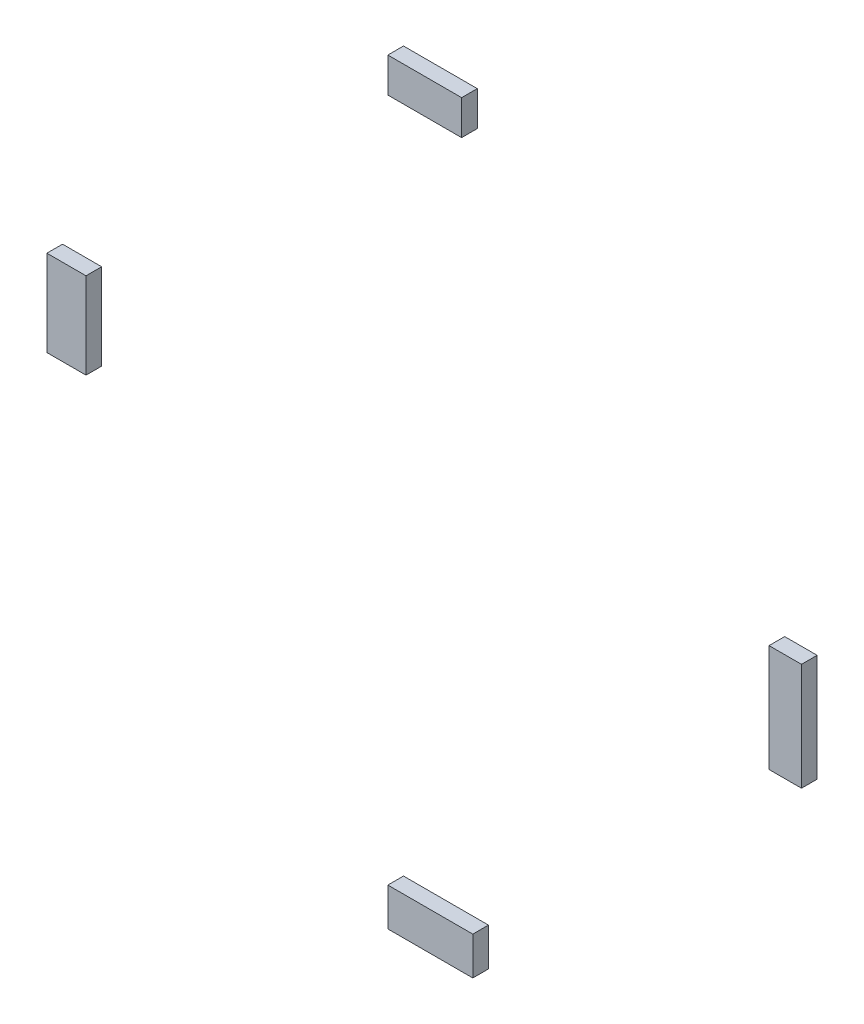
ISO-10303-21;
HEADER;
FILE_DESCRIPTION(('STEP AP214'),'2;1');
FILE_NAME('part.step','',(''),(''),'','','');
FILE_SCHEMA(('AUTOMOTIVE_DESIGN { 1 0 10303 214 1 1 1 1 }'));
ENDSEC;
DATA;
#1=APPLICATION_CONTEXT('core data for automotive mechanical design processes');
#2=APPLICATION_PROTOCOL_DEFINITION('international standard','automotive_design',2000,#1);
#3=PRODUCT_CONTEXT('',#1,'mechanical');
#4=PRODUCT('Part','Part','',(#3));
#5=PRODUCT_RELATED_PRODUCT_CATEGORY('part','',(#4));
#6=PRODUCT_DEFINITION_FORMATION('','',#4);
#7=PRODUCT_DEFINITION_CONTEXT('part definition',#1,'design');
#8=PRODUCT_DEFINITION('design','',#6,#7);
#9=PRODUCT_DEFINITION_SHAPE('','',#8);
#10=(LENGTH_UNIT() NAMED_UNIT(*) SI_UNIT(.MILLI.,.METRE.));
#11=(NAMED_UNIT(*) PLANE_ANGLE_UNIT() SI_UNIT($,.RADIAN.));
#12=(NAMED_UNIT(*) SI_UNIT($,.STERADIAN.) SOLID_ANGLE_UNIT());
#13=UNCERTAINTY_MEASURE_WITH_UNIT(LENGTH_MEASURE(1.E-05),#10,'distance_accuracy_value','');
#14=(GEOMETRIC_REPRESENTATION_CONTEXT(3) GLOBAL_UNCERTAINTY_ASSIGNED_CONTEXT((#13)) GLOBAL_UNIT_ASSIGNED_CONTEXT((#10,
#11,#12)) REPRESENTATION_CONTEXT('',''));
#15=CARTESIAN_POINT('',(0.,0.,0.));
#16=DIRECTION('',(0.,0.,1.));
#17=DIRECTION('',(1.,0.,0.));
#18=AXIS2_PLACEMENT_3D('',#15,#16,#17);
#19=CARTESIAN_POINT('',(-7.17351111937392,-65.1449777129052,3.));
#20=DIRECTION('',(1.,0.,0.));
#21=DIRECTION('',(0.,0.,-1.));
#22=AXIS2_PLACEMENT_3D('',#19,#20,#21);
#23=PLANE('',#22);
#24=DIRECTION('',(0.,-1.,0.));
#25=VECTOR('',#24,1.);
#26=CARTESIAN_POINT('',(-7.17351111937392,-65.1449777129052,0.));
#27=LINE('',#26,#25);
#28=CARTESIAN_POINT('',(-7.17351111937392,-65.1449777129052,0.));
#29=VERTEX_POINT('',#28);
#30=CARTESIAN_POINT('',(-7.17351111937392,-72.4317120589617,0.));
#31=VERTEX_POINT('',#30);
#32=EDGE_CURVE('E12',#29,#31,#27,.T.);
#33=ORIENTED_EDGE('',*,*,#32,.T.);
#34=DIRECTION('',(0.,0.,-1.));
#35=VECTOR('',#34,1.);
#36=CARTESIAN_POINT('',(-7.17351111937392,-72.4317120589617,3.));
#37=LINE('',#36,#35);
#38=CARTESIAN_POINT('',(-7.17351111937392,-72.4317120589617,3.));
#39=VERTEX_POINT('',#38);
#40=EDGE_CURVE('E121',#39,#31,#37,.T.);
#41=ORIENTED_EDGE('',*,*,#40,.F.);
#42=DIRECTION('',(0.,-1.,0.));
#43=VECTOR('',#42,1.);
#44=CARTESIAN_POINT('',(-7.17351111937392,-65.1449777129052,3.));
#45=LINE('',#44,#43);
#46=CARTESIAN_POINT('',(-7.17351111937392,-65.1449777129052,3.));
#47=VERTEX_POINT('',#46);
#48=EDGE_CURVE('E54',#47,#39,#45,.T.);
#49=ORIENTED_EDGE('',*,*,#48,.F.);
#50=DIRECTION('',(0.,0.,-1.));
#51=VECTOR('',#50,1.);
#52=CARTESIAN_POINT('',(-7.17351111937392,-65.1449777129052,3.));
#53=LINE('',#52,#51);
#54=EDGE_CURVE('E109',#47,#29,#53,.T.);
#55=ORIENTED_EDGE('',*,*,#54,.T.);
#56=EDGE_LOOP('',(#33,#41,#49,#55));
#57=FACE_BOUND('',#56,.T.);
#58=ADVANCED_FACE('F50',(#57),#23,.F.);
#59=CARTESIAN_POINT('',(-7.17351111937392,-72.4317120589617,3.));
#60=DIRECTION('',(0.,1.,0.));
#61=DIRECTION('',(0.,0.,1.));
#62=AXIS2_PLACEMENT_3D('',#59,#60,#61);
#63=PLANE('',#62);
#64=DIRECTION('',(1.,0.,0.));
#65=VECTOR('',#64,1.);
#66=CARTESIAN_POINT('',(-7.17351111937392,-72.4317120589617,0.));
#67=LINE('',#66,#65);
#68=CARTESIAN_POINT('',(9.11448330122297,-72.4317120589617,0.));
#69=VERTEX_POINT('',#68);
#70=EDGE_CURVE('E60',#31,#69,#67,.T.);
#71=ORIENTED_EDGE('',*,*,#70,.T.);
#72=DIRECTION('',(0.,0.,-1.));
#73=VECTOR('',#72,1.);
#74=CARTESIAN_POINT('',(9.11448330122297,-72.4317120589617,3.));
#75=LINE('',#74,#73);
#76=CARTESIAN_POINT('',(9.11448330122297,-72.4317120589617,3.));
#77=VERTEX_POINT('',#76);
#78=EDGE_CURVE('E105',#77,#69,#75,.T.);
#79=ORIENTED_EDGE('',*,*,#78,.F.);
#80=DIRECTION('',(1.,0.,0.));
#81=VECTOR('',#80,1.);
#82=CARTESIAN_POINT('',(-7.17351111937392,-72.4317120589617,3.));
#83=LINE('',#82,#81);
#84=EDGE_CURVE('E84',#39,#77,#83,.T.);
#85=ORIENTED_EDGE('',*,*,#84,.F.);
#86=ORIENTED_EDGE('',*,*,#40,.T.);
#87=EDGE_LOOP('',(#71,#79,#85,#86));
#88=FACE_BOUND('',#87,.T.);
#89=ADVANCED_FACE('F124',(#88),#63,.F.);
#90=CARTESIAN_POINT('',(9.11448330122297,-65.1449777129052,3.));
#91=DIRECTION('',(-1.,0.,0.));
#92=DIRECTION('',(0.,0.,1.));
#93=AXIS2_PLACEMENT_3D('',#90,#91,#92);
#94=PLANE('',#93);
#95=DIRECTION('',(0.,1.,0.));
#96=VECTOR('',#95,1.);
#97=CARTESIAN_POINT('',(9.11448330122297,-65.1449777129052,0.));
#98=LINE('',#97,#96);
#99=CARTESIAN_POINT('',(9.11448330122297,-65.1449777129052,0.));
#100=VERTEX_POINT('',#99);
#101=EDGE_CURVE('E100',#69,#100,#98,.T.);
#102=ORIENTED_EDGE('',*,*,#101,.T.);
#103=DIRECTION('',(0.,0.,-1.));
#104=VECTOR('',#103,1.);
#105=CARTESIAN_POINT('',(9.11448330122297,-65.1449777129052,3.));
#106=LINE('',#105,#104);
#107=CARTESIAN_POINT('',(9.11448330122297,-65.1449777129052,3.));
#108=VERTEX_POINT('',#107);
#109=EDGE_CURVE('E103',#108,#100,#106,.T.);
#110=ORIENTED_EDGE('',*,*,#109,.F.);
#111=DIRECTION('',(0.,1.,0.));
#112=VECTOR('',#111,1.);
#113=CARTESIAN_POINT('',(9.11448330122297,-65.1449777129052,3.));
#114=LINE('',#113,#112);
#115=EDGE_CURVE('E117',#77,#108,#114,.T.);
#116=ORIENTED_EDGE('',*,*,#115,.F.);
#117=ORIENTED_EDGE('',*,*,#78,.T.);
#118=EDGE_LOOP('',(#102,#110,#116,#117));
#119=FACE_BOUND('',#118,.T.);
#120=ADVANCED_FACE('F101',(#119),#94,.F.);
#121=CARTESIAN_POINT('',(-7.17351111937392,-65.1449777129052,3.));
#122=DIRECTION('',(0.,-1.,0.));
#123=DIRECTION('',(0.,0.,-1.));
#124=AXIS2_PLACEMENT_3D('',#121,#122,#123);
#125=PLANE('',#124);
#126=DIRECTION('',(-1.,0.,0.));
#127=VECTOR('',#126,1.);
#128=CARTESIAN_POINT('',(-7.17351111937392,-65.1449777129052,0.));
#129=LINE('',#128,#127);
#130=EDGE_CURVE('E94',#100,#29,#129,.T.);
#131=ORIENTED_EDGE('',*,*,#130,.T.);
#132=ORIENTED_EDGE('',*,*,#54,.F.);
#133=DIRECTION('',(-1.,0.,0.));
#134=VECTOR('',#133,1.);
#135=CARTESIAN_POINT('',(-7.17351111937392,-65.1449777129052,3.));
#136=LINE('',#135,#134);
#137=EDGE_CURVE('E108',#108,#47,#136,.T.);
#138=ORIENTED_EDGE('',*,*,#137,.F.);
#139=ORIENTED_EDGE('',*,*,#109,.T.);
#140=EDGE_LOOP('',(#131,#132,#138,#139));
#141=FACE_BOUND('',#140,.T.);
#142=ADVANCED_FACE('F107',(#141),#125,.F.);
#143=CARTESIAN_POINT('',(0.,0.,3.));
#144=DIRECTION('',(0.,0.,1.));
#145=DIRECTION('',(1.,0.,0.));
#146=AXIS2_PLACEMENT_3D('',#143,#144,#145);
#147=PLANE('',#146);
#148=ORIENTED_EDGE('',*,*,#48,.T.);
#149=ORIENTED_EDGE('',*,*,#84,.T.);
#150=ORIENTED_EDGE('',*,*,#115,.T.);
#151=ORIENTED_EDGE('',*,*,#137,.T.);
#152=EDGE_LOOP('',(#148,#149,#150,#151));
#153=FACE_BOUND('',#152,.T.);
#154=ADVANCED_FACE('F52',(#153),#147,.T.);
#155=CARTESIAN_POINT('',(0.,0.,0.));
#156=DIRECTION('',(0.,0.,1.));
#157=DIRECTION('',(1.,0.,0.));
#158=AXIS2_PLACEMENT_3D('',#155,#156,#157);
#159=PLANE('',#158);
#160=ORIENTED_EDGE('',*,*,#32,.F.);
#161=ORIENTED_EDGE('',*,*,#130,.F.);
#162=ORIENTED_EDGE('',*,*,#101,.F.);
#163=ORIENTED_EDGE('',*,*,#70,.F.);
#164=EDGE_LOOP('',(#160,#161,#162,#163));
#165=FACE_BOUND('',#164,.T.);
#166=ADVANCED_FACE('F111',(#165),#159,.F.);
#167=CLOSED_SHELL('',(#58,#89,#120,#142,#154,#166));
#168=MANIFOLD_SOLID_BREP('B2',#167);
#169=CARTESIAN_POINT('',(65.9081480572516,11.1514172046276,3.));
#170=DIRECTION('',(1.,0.,0.));
#171=DIRECTION('',(0.,0.,-1.));
#172=AXIS2_PLACEMENT_3D('',#169,#170,#171);
#173=PLANE('',#172);
#174=DIRECTION('',(0.,-1.,0.));
#175=VECTOR('',#174,1.);
#176=CARTESIAN_POINT('',(65.9081480572516,11.1514172046276,0.));
#177=LINE('',#176,#175);
#178=CARTESIAN_POINT('',(65.9081480572516,11.1514172046276,0.));
#179=VERTEX_POINT('',#178);
#180=CARTESIAN_POINT('',(65.9081480572516,-9.42289153717896,0.));
#181=VERTEX_POINT('',#180);
#182=EDGE_CURVE('E48',#179,#181,#177,.T.);
#183=ORIENTED_EDGE('',*,*,#182,.T.);
#184=DIRECTION('',(0.,0.,-1.));
#185=VECTOR('',#184,1.);
#186=CARTESIAN_POINT('',(65.9081480572516,-9.42289153717896,3.));
#187=LINE('',#186,#185);
#188=CARTESIAN_POINT('',(65.9081480572516,-9.42289153717896,3.));
#189=VERTEX_POINT('',#188);
#190=EDGE_CURVE('E255',#189,#181,#187,.T.);
#191=ORIENTED_EDGE('',*,*,#190,.F.);
#192=DIRECTION('',(0.,-1.,0.));
#193=VECTOR('',#192,1.);
#194=CARTESIAN_POINT('',(65.9081480572516,11.1514172046276,3.));
#195=LINE('',#194,#193);
#196=CARTESIAN_POINT('',(65.9081480572516,11.1514172046276,3.));
#197=VERTEX_POINT('',#196);
#198=EDGE_CURVE('E188',#197,#189,#195,.T.);
#199=ORIENTED_EDGE('',*,*,#198,.F.);
#200=DIRECTION('',(0.,0.,-1.));
#201=VECTOR('',#200,1.);
#202=CARTESIAN_POINT('',(65.9081480572516,11.1514172046276,3.));
#203=LINE('',#202,#201);
#204=EDGE_CURVE('E243',#197,#179,#203,.T.);
#205=ORIENTED_EDGE('',*,*,#204,.T.);
#206=EDGE_LOOP('',(#183,#191,#199,#205));
#207=FACE_BOUND('',#206,.T.);
#208=ADVANCED_FACE('F184',(#207),#173,.F.);
#209=CARTESIAN_POINT('',(65.9081480572516,-9.42289153717896,3.));
#210=DIRECTION('',(0.,1.,0.));
#211=DIRECTION('',(0.,0.,1.));
#212=AXIS2_PLACEMENT_3D('',#209,#210,#211);
#213=PLANE('',#212);
#214=DIRECTION('',(1.,0.,0.));
#215=VECTOR('',#214,1.);
#216=CARTESIAN_POINT('',(65.9081480572516,-9.42289153717896,0.));
#217=LINE('',#216,#215);
#218=CARTESIAN_POINT('',(72.1233038230056,-9.42289153717896,0.));
#219=VERTEX_POINT('',#218);
#220=EDGE_CURVE('E194',#181,#219,#217,.T.);
#221=ORIENTED_EDGE('',*,*,#220,.T.);
#222=DIRECTION('',(0.,0.,-1.));
#223=VECTOR('',#222,1.);
#224=CARTESIAN_POINT('',(72.1233038230056,-9.42289153717896,3.));
#225=LINE('',#224,#223);
#226=CARTESIAN_POINT('',(72.1233038230056,-9.42289153717896,3.));
#227=VERTEX_POINT('',#226);
#228=EDGE_CURVE('E239',#227,#219,#225,.T.);
#229=ORIENTED_EDGE('',*,*,#228,.F.);
#230=DIRECTION('',(1.,0.,0.));
#231=VECTOR('',#230,1.);
#232=CARTESIAN_POINT('',(65.9081480572516,-9.42289153717896,3.));
#233=LINE('',#232,#231);
#234=EDGE_CURVE('E218',#189,#227,#233,.T.);
#235=ORIENTED_EDGE('',*,*,#234,.F.);
#236=ORIENTED_EDGE('',*,*,#190,.T.);
#237=EDGE_LOOP('',(#221,#229,#235,#236));
#238=FACE_BOUND('',#237,.T.);
#239=ADVANCED_FACE('F258',(#238),#213,.F.);
#240=CARTESIAN_POINT('',(72.1233038230056,11.1514172046276,3.));
#241=DIRECTION('',(-1.,0.,0.));
#242=DIRECTION('',(0.,0.,1.));
#243=AXIS2_PLACEMENT_3D('',#240,#241,#242);
#244=PLANE('',#243);
#245=DIRECTION('',(0.,1.,0.));
#246=VECTOR('',#245,1.);
#247=CARTESIAN_POINT('',(72.1233038230056,11.1514172046276,0.));
#248=LINE('',#247,#246);
#249=CARTESIAN_POINT('',(72.1233038230056,11.1514172046276,0.));
#250=VERTEX_POINT('',#249);
#251=EDGE_CURVE('E234',#219,#250,#248,.T.);
#252=ORIENTED_EDGE('',*,*,#251,.T.);
#253=DIRECTION('',(0.,0.,-1.));
#254=VECTOR('',#253,1.);
#255=CARTESIAN_POINT('',(72.1233038230056,11.1514172046276,3.));
#256=LINE('',#255,#254);
#257=CARTESIAN_POINT('',(72.1233038230056,11.1514172046276,3.));
#258=VERTEX_POINT('',#257);
#259=EDGE_CURVE('E237',#258,#250,#256,.T.);
#260=ORIENTED_EDGE('',*,*,#259,.F.);
#261=DIRECTION('',(0.,1.,0.));
#262=VECTOR('',#261,1.);
#263=CARTESIAN_POINT('',(72.1233038230056,11.1514172046276,3.));
#264=LINE('',#263,#262);
#265=EDGE_CURVE('E251',#227,#258,#264,.T.);
#266=ORIENTED_EDGE('',*,*,#265,.F.);
#267=ORIENTED_EDGE('',*,*,#228,.T.);
#268=EDGE_LOOP('',(#252,#260,#266,#267));
#269=FACE_BOUND('',#268,.T.);
#270=ADVANCED_FACE('F235',(#269),#244,.F.);
#271=CARTESIAN_POINT('',(65.9081480572516,11.1514172046276,3.));
#272=DIRECTION('',(0.,-1.,0.));
#273=DIRECTION('',(0.,0.,-1.));
#274=AXIS2_PLACEMENT_3D('',#271,#272,#273);
#275=PLANE('',#274);
#276=DIRECTION('',(-1.,0.,0.));
#277=VECTOR('',#276,1.);
#278=CARTESIAN_POINT('',(65.9081480572516,11.1514172046276,0.));
#279=LINE('',#278,#277);
#280=EDGE_CURVE('E228',#250,#179,#279,.T.);
#281=ORIENTED_EDGE('',*,*,#280,.T.);
#282=ORIENTED_EDGE('',*,*,#204,.F.);
#283=DIRECTION('',(-1.,0.,0.));
#284=VECTOR('',#283,1.);
#285=CARTESIAN_POINT('',(65.9081480572516,11.1514172046276,3.));
#286=LINE('',#285,#284);
#287=EDGE_CURVE('E242',#258,#197,#286,.T.);
#288=ORIENTED_EDGE('',*,*,#287,.F.);
#289=ORIENTED_EDGE('',*,*,#259,.T.);
#290=EDGE_LOOP('',(#281,#282,#288,#289));
#291=FACE_BOUND('',#290,.T.);
#292=ADVANCED_FACE('F241',(#291),#275,.F.);
#293=CARTESIAN_POINT('',(0.,0.,3.));
#294=DIRECTION('',(0.,0.,1.));
#295=DIRECTION('',(1.,0.,0.));
#296=AXIS2_PLACEMENT_3D('',#293,#294,#295);
#297=PLANE('',#296);
#298=ORIENTED_EDGE('',*,*,#198,.T.);
#299=ORIENTED_EDGE('',*,*,#234,.T.);
#300=ORIENTED_EDGE('',*,*,#265,.T.);
#301=ORIENTED_EDGE('',*,*,#287,.T.);
#302=EDGE_LOOP('',(#298,#299,#300,#301));
#303=FACE_BOUND('',#302,.T.);
#304=ADVANCED_FACE('F186',(#303),#297,.T.);
#305=CARTESIAN_POINT('',(0.,0.,0.));
#306=DIRECTION('',(0.,0.,1.));
#307=DIRECTION('',(1.,0.,0.));
#308=AXIS2_PLACEMENT_3D('',#305,#306,#307);
#309=PLANE('',#308);
#310=ORIENTED_EDGE('',*,*,#182,.F.);
#311=ORIENTED_EDGE('',*,*,#280,.F.);
#312=ORIENTED_EDGE('',*,*,#251,.F.);
#313=ORIENTED_EDGE('',*,*,#220,.F.);
#314=EDGE_LOOP('',(#310,#311,#312,#313));
#315=FACE_BOUND('',#314,.T.);
#316=ADVANCED_FACE('F245',(#315),#309,.F.);
#317=CLOSED_SHELL('',(#208,#239,#270,#292,#304,#316));
#318=MANIFOLD_SOLID_BREP('B6',#317);
#319=CARTESIAN_POINT('',(-72.5398045178219,7.07941859947841,3.));
#320=DIRECTION('',(1.,0.,0.));
#321=DIRECTION('',(0.,0.,-1.));
#322=AXIS2_PLACEMENT_3D('',#319,#320,#321);
#323=PLANE('',#322);
#324=DIRECTION('',(0.,-1.,0.));
#325=VECTOR('',#324,1.);
#326=CARTESIAN_POINT('',(-72.5398045178219,7.07941859947841,0.));
#327=LINE('',#326,#325);
#328=CARTESIAN_POINT('',(-72.5398045178219,7.07941859947841,0.));
#329=VERTEX_POINT('',#328);
#330=CARTESIAN_POINT('',(-72.5398045178219,-9.42289153717896,0.));
#331=VERTEX_POINT('',#330);
#332=EDGE_CURVE('E182',#329,#331,#327,.T.);
#333=ORIENTED_EDGE('',*,*,#332,.T.);
#334=DIRECTION('',(0.,0.,-1.));
#335=VECTOR('',#334,1.);
#336=CARTESIAN_POINT('',(-72.5398045178219,-9.42289153717896,3.));
#337=LINE('',#336,#335);
#338=CARTESIAN_POINT('',(-72.5398045178219,-9.42289153717896,3.));
#339=VERTEX_POINT('',#338);
#340=EDGE_CURVE('E388',#339,#331,#337,.T.);
#341=ORIENTED_EDGE('',*,*,#340,.F.);
#342=DIRECTION('',(0.,-1.,0.));
#343=VECTOR('',#342,1.);
#344=CARTESIAN_POINT('',(-72.5398045178219,7.07941859947841,3.));
#345=LINE('',#344,#343);
#346=CARTESIAN_POINT('',(-72.5398045178219,7.07941859947841,3.));
#347=VERTEX_POINT('',#346);
#348=EDGE_CURVE('E321',#347,#339,#345,.T.);
#349=ORIENTED_EDGE('',*,*,#348,.F.);
#350=DIRECTION('',(0.,0.,-1.));
#351=VECTOR('',#350,1.);
#352=CARTESIAN_POINT('',(-72.5398045178219,7.07941859947841,3.));
#353=LINE('',#352,#351);
#354=EDGE_CURVE('E376',#347,#329,#353,.T.);
#355=ORIENTED_EDGE('',*,*,#354,.T.);
#356=EDGE_LOOP('',(#333,#341,#349,#355));
#357=FACE_BOUND('',#356,.T.);
#358=ADVANCED_FACE('F317',(#357),#323,.F.);
#359=CARTESIAN_POINT('',(-72.5398045178219,-9.42289153717896,3.));
#360=DIRECTION('',(0.,1.,0.));
#361=DIRECTION('',(0.,0.,1.));
#362=AXIS2_PLACEMENT_3D('',#359,#360,#361);
#363=PLANE('',#362);
#364=DIRECTION('',(1.,0.,0.));
#365=VECTOR('',#364,1.);
#366=CARTESIAN_POINT('',(-72.5398045178219,-9.42289153717896,0.));
#367=LINE('',#366,#365);
#368=CARTESIAN_POINT('',(-65.0387544557049,-9.42289153717896,0.));
#369=VERTEX_POINT('',#368);
#370=EDGE_CURVE('E327',#331,#369,#367,.T.);
#371=ORIENTED_EDGE('',*,*,#370,.T.);
#372=DIRECTION('',(0.,0.,-1.));
#373=VECTOR('',#372,1.);
#374=CARTESIAN_POINT('',(-65.0387544557049,-9.42289153717896,3.));
#375=LINE('',#374,#373);
#376=CARTESIAN_POINT('',(-65.0387544557049,-9.42289153717896,3.));
#377=VERTEX_POINT('',#376);
#378=EDGE_CURVE('E372',#377,#369,#375,.T.);
#379=ORIENTED_EDGE('',*,*,#378,.F.);
#380=DIRECTION('',(1.,0.,0.));
#381=VECTOR('',#380,1.);
#382=CARTESIAN_POINT('',(-72.5398045178219,-9.42289153717896,3.));
#383=LINE('',#382,#381);
#384=EDGE_CURVE('E351',#339,#377,#383,.T.);
#385=ORIENTED_EDGE('',*,*,#384,.F.);
#386=ORIENTED_EDGE('',*,*,#340,.T.);
#387=EDGE_LOOP('',(#371,#379,#385,#386));
#388=FACE_BOUND('',#387,.T.);
#389=ADVANCED_FACE('F391',(#388),#363,.F.);
#390=CARTESIAN_POINT('',(-65.0387544557049,7.07941859947841,3.));
#391=DIRECTION('',(-1.,0.,0.));
#392=DIRECTION('',(0.,0.,1.));
#393=AXIS2_PLACEMENT_3D('',#390,#391,#392);
#394=PLANE('',#393);
#395=DIRECTION('',(0.,1.,0.));
#396=VECTOR('',#395,1.);
#397=CARTESIAN_POINT('',(-65.0387544557049,7.07941859947841,0.));
#398=LINE('',#397,#396);
#399=CARTESIAN_POINT('',(-65.0387544557049,7.07941859947841,0.));
#400=VERTEX_POINT('',#399);
#401=EDGE_CURVE('E367',#369,#400,#398,.T.);
#402=ORIENTED_EDGE('',*,*,#401,.T.);
#403=DIRECTION('',(0.,0.,-1.));
#404=VECTOR('',#403,1.);
#405=CARTESIAN_POINT('',(-65.0387544557049,7.07941859947841,3.));
#406=LINE('',#405,#404);
#407=CARTESIAN_POINT('',(-65.0387544557049,7.07941859947841,3.));
#408=VERTEX_POINT('',#407);
#409=EDGE_CURVE('E370',#408,#400,#406,.T.);
#410=ORIENTED_EDGE('',*,*,#409,.F.);
#411=DIRECTION('',(0.,1.,0.));
#412=VECTOR('',#411,1.);
#413=CARTESIAN_POINT('',(-65.0387544557049,7.07941859947841,3.));
#414=LINE('',#413,#412);
#415=EDGE_CURVE('E384',#377,#408,#414,.T.);
#416=ORIENTED_EDGE('',*,*,#415,.F.);
#417=ORIENTED_EDGE('',*,*,#378,.T.);
#418=EDGE_LOOP('',(#402,#410,#416,#417));
#419=FACE_BOUND('',#418,.T.);
#420=ADVANCED_FACE('F368',(#419),#394,.F.);
#421=CARTESIAN_POINT('',(-72.5398045178219,7.07941859947841,3.));
#422=DIRECTION('',(0.,-1.,0.));
#423=DIRECTION('',(0.,0.,-1.));
#424=AXIS2_PLACEMENT_3D('',#421,#422,#423);
#425=PLANE('',#424);
#426=DIRECTION('',(-1.,0.,0.));
#427=VECTOR('',#426,1.);
#428=CARTESIAN_POINT('',(-72.5398045178219,7.07941859947841,0.));
#429=LINE('',#428,#427);
#430=EDGE_CURVE('E361',#400,#329,#429,.T.);
#431=ORIENTED_EDGE('',*,*,#430,.T.);
#432=ORIENTED_EDGE('',*,*,#354,.F.);
#433=DIRECTION('',(-1.,0.,0.));
#434=VECTOR('',#433,1.);
#435=CARTESIAN_POINT('',(-72.5398045178219,7.07941859947841,3.));
#436=LINE('',#435,#434);
#437=EDGE_CURVE('E375',#408,#347,#436,.T.);
#438=ORIENTED_EDGE('',*,*,#437,.F.);
#439=ORIENTED_EDGE('',*,*,#409,.T.);
#440=EDGE_LOOP('',(#431,#432,#438,#439));
#441=FACE_BOUND('',#440,.T.);
#442=ADVANCED_FACE('F374',(#441),#425,.F.);
#443=CARTESIAN_POINT('',(0.,0.,3.));
#444=DIRECTION('',(0.,0.,1.));
#445=DIRECTION('',(1.,0.,0.));
#446=AXIS2_PLACEMENT_3D('',#443,#444,#445);
#447=PLANE('',#446);
#448=ORIENTED_EDGE('',*,*,#348,.T.);
#449=ORIENTED_EDGE('',*,*,#384,.T.);
#450=ORIENTED_EDGE('',*,*,#415,.T.);
#451=ORIENTED_EDGE('',*,*,#437,.T.);
#452=EDGE_LOOP('',(#448,#449,#450,#451));
#453=FACE_BOUND('',#452,.T.);
#454=ADVANCED_FACE('F319',(#453),#447,.T.);
#455=CARTESIAN_POINT('',(0.,0.,0.));
#456=DIRECTION('',(0.,0.,1.));
#457=DIRECTION('',(1.,0.,0.));
#458=AXIS2_PLACEMENT_3D('',#455,#456,#457);
#459=PLANE('',#458);
#460=ORIENTED_EDGE('',*,*,#332,.F.);
#461=ORIENTED_EDGE('',*,*,#430,.F.);
#462=ORIENTED_EDGE('',*,*,#401,.F.);
#463=ORIENTED_EDGE('',*,*,#370,.F.);
#464=EDGE_LOOP('',(#460,#461,#462,#463));
#465=FACE_BOUND('',#464,.T.);
#466=ADVANCED_FACE('F378',(#465),#459,.F.);
#467=CLOSED_SHELL('',(#358,#389,#420,#442,#454,#466));
#468=MANIFOLD_SOLID_BREP('B42',#467);
#469=CARTESIAN_POINT('',(-7.17351111937392,72.6600277139869,3.));
#470=DIRECTION('',(1.,0.,0.));
#471=DIRECTION('',(0.,0.,-1.));
#472=AXIS2_PLACEMENT_3D('',#469,#470,#471);
#473=PLANE('',#472);
#474=DIRECTION('',(0.,-1.,0.));
#475=VECTOR('',#474,1.);
#476=CARTESIAN_POINT('',(-7.17351111937392,72.6600277139869,0.));
#477=LINE('',#476,#475);
#478=CARTESIAN_POINT('',(-7.17351111937392,72.6600277139869,0.));
#479=VERTEX_POINT('',#478);
#480=CARTESIAN_POINT('',(-7.17351111937392,66.0162405161119,0.));
#481=VERTEX_POINT('',#480);
#482=EDGE_CURVE('E504',#479,#481,#477,.T.);
#483=ORIENTED_EDGE('',*,*,#482,.T.);
#484=DIRECTION('',(0.,0.,-1.));
#485=VECTOR('',#484,1.);
#486=CARTESIAN_POINT('',(-7.17351111937392,66.0162405161119,3.));
#487=LINE('',#486,#485);
#488=CARTESIAN_POINT('',(-7.17351111937392,66.0162405161119,3.));
#489=VERTEX_POINT('',#488);
#490=EDGE_CURVE('E315',#489,#481,#487,.T.);
#491=ORIENTED_EDGE('',*,*,#490,.F.);
#492=DIRECTION('',(0.,-1.,0.));
#493=VECTOR('',#492,1.);
#494=CARTESIAN_POINT('',(-7.17351111937392,72.6600277139869,3.));
#495=LINE('',#494,#493);
#496=CARTESIAN_POINT('',(-7.17351111937392,72.6600277139869,3.));
#497=VERTEX_POINT('',#496);
#498=EDGE_CURVE('E492',#497,#489,#495,.T.);
#499=ORIENTED_EDGE('',*,*,#498,.F.);
#500=DIRECTION('',(0.,0.,-1.));
#501=VECTOR('',#500,1.);
#502=CARTESIAN_POINT('',(-7.17351111937392,72.6600277139869,3.));
#503=LINE('',#502,#501);
#504=EDGE_CURVE('E500',#497,#479,#503,.T.);
#505=ORIENTED_EDGE('',*,*,#504,.T.);
#506=EDGE_LOOP('',(#483,#491,#499,#505));
#507=FACE_BOUND('',#506,.T.);
#508=ADVANCED_FACE('F441',(#507),#473,.F.);
#509=CARTESIAN_POINT('',(-7.17351111937392,66.0162405161119,3.));
#510=DIRECTION('',(0.,1.,0.));
#511=DIRECTION('',(0.,0.,1.));
#512=AXIS2_PLACEMENT_3D('',#509,#510,#511);
#513=PLANE('',#512);
#514=DIRECTION('',(1.,0.,0.));
#515=VECTOR('',#514,1.);
#516=CARTESIAN_POINT('',(-7.17351111937392,66.0162405161119,0.));
#517=LINE('',#516,#515);
#518=CARTESIAN_POINT('',(6.9713261406181,66.0162405161119,0.));
#519=VERTEX_POINT('',#518);
#520=EDGE_CURVE('E496',#481,#519,#517,.T.);
#521=ORIENTED_EDGE('',*,*,#520,.T.);
#522=DIRECTION('',(0.,0.,-1.));
#523=VECTOR('',#522,1.);
#524=CARTESIAN_POINT('',(6.9713261406181,66.0162405161119,3.));
#525=LINE('',#524,#523);
#526=CARTESIAN_POINT('',(6.9713261406181,66.0162405161119,3.));
#527=VERTEX_POINT('',#526);
#528=EDGE_CURVE('E449',#527,#519,#525,.T.);
#529=ORIENTED_EDGE('',*,*,#528,.F.);
#530=DIRECTION('',(1.,0.,0.));
#531=VECTOR('',#530,1.);
#532=CARTESIAN_POINT('',(-7.17351111937392,66.0162405161119,3.));
#533=LINE('',#532,#531);
#534=EDGE_CURVE('E487',#489,#527,#533,.T.);
#535=ORIENTED_EDGE('',*,*,#534,.F.);
#536=ORIENTED_EDGE('',*,*,#490,.T.);
#537=EDGE_LOOP('',(#521,#529,#535,#536));
#538=FACE_BOUND('',#537,.T.);
#539=ADVANCED_FACE('F495',(#538),#513,.F.);
#540=CARTESIAN_POINT('',(6.9713261406181,72.6600277139869,3.));
#541=DIRECTION('',(-1.,0.,0.));
#542=DIRECTION('',(0.,0.,1.));
#543=AXIS2_PLACEMENT_3D('',#540,#541,#542);
#544=PLANE('',#543);
#545=DIRECTION('',(0.,1.,0.));
#546=VECTOR('',#545,1.);
#547=CARTESIAN_POINT('',(6.9713261406181,72.6600277139869,0.));
#548=LINE('',#547,#546);
#549=CARTESIAN_POINT('',(6.9713261406181,72.6600277139869,0.));
#550=VERTEX_POINT('',#549);
#551=EDGE_CURVE('E474',#519,#550,#548,.T.);
#552=ORIENTED_EDGE('',*,*,#551,.T.);
#553=DIRECTION('',(0.,0.,-1.));
#554=VECTOR('',#553,1.);
#555=CARTESIAN_POINT('',(6.9713261406181,72.6600277139869,3.));
#556=LINE('',#555,#554);
#557=CARTESIAN_POINT('',(6.9713261406181,72.6600277139869,3.));
#558=VERTEX_POINT('',#557);
#559=EDGE_CURVE('E497',#558,#550,#556,.T.);
#560=ORIENTED_EDGE('',*,*,#559,.F.);
#561=DIRECTION('',(0.,1.,0.));
#562=VECTOR('',#561,1.);
#563=CARTESIAN_POINT('',(6.9713261406181,72.6600277139869,3.));
#564=LINE('',#563,#562);
#565=EDGE_CURVE('E490',#527,#558,#564,.T.);
#566=ORIENTED_EDGE('',*,*,#565,.F.);
#567=ORIENTED_EDGE('',*,*,#528,.T.);
#568=EDGE_LOOP('',(#552,#560,#566,#567));
#569=FACE_BOUND('',#568,.T.);
#570=ADVANCED_FACE('F498',(#569),#544,.F.);
#571=CARTESIAN_POINT('',(-7.17351111937392,72.6600277139869,3.));
#572=DIRECTION('',(0.,-1.,0.));
#573=DIRECTION('',(0.,0.,-1.));
#574=AXIS2_PLACEMENT_3D('',#571,#572,#573);
#575=PLANE('',#574);
#576=DIRECTION('',(-1.,0.,0.));
#577=VECTOR('',#576,1.);
#578=CARTESIAN_POINT('',(-7.17351111937392,72.6600277139869,0.));
#579=LINE('',#578,#577);
#580=EDGE_CURVE('E480',#550,#479,#579,.T.);
#581=ORIENTED_EDGE('',*,*,#580,.T.);
#582=ORIENTED_EDGE('',*,*,#504,.F.);
#583=DIRECTION('',(-1.,0.,0.));
#584=VECTOR('',#583,1.);
#585=CARTESIAN_POINT('',(-7.17351111937392,72.6600277139869,3.));
#586=LINE('',#585,#584);
#587=EDGE_CURVE('E457',#558,#497,#586,.T.);
#588=ORIENTED_EDGE('',*,*,#587,.F.);
#589=ORIENTED_EDGE('',*,*,#559,.T.);
#590=EDGE_LOOP('',(#581,#582,#588,#589));
#591=FACE_BOUND('',#590,.T.);
#592=ADVANCED_FACE('F511',(#591),#575,.F.);
#593=CARTESIAN_POINT('',(0.,0.,3.));
#594=DIRECTION('',(0.,0.,1.));
#595=DIRECTION('',(1.,0.,0.));
#596=AXIS2_PLACEMENT_3D('',#593,#594,#595);
#597=PLANE('',#596);
#598=ORIENTED_EDGE('',*,*,#498,.T.);
#599=ORIENTED_EDGE('',*,*,#534,.T.);
#600=ORIENTED_EDGE('',*,*,#565,.T.);
#601=ORIENTED_EDGE('',*,*,#587,.T.);
#602=EDGE_LOOP('',(#598,#599,#600,#601));
#603=FACE_BOUND('',#602,.T.);
#604=ADVANCED_FACE('F488',(#603),#597,.T.);
#605=CARTESIAN_POINT('',(0.,0.,0.));
#606=DIRECTION('',(0.,0.,1.));
#607=DIRECTION('',(1.,0.,0.));
#608=AXIS2_PLACEMENT_3D('',#605,#606,#607);
#609=PLANE('',#608);
#610=ORIENTED_EDGE('',*,*,#482,.F.);
#611=ORIENTED_EDGE('',*,*,#580,.F.);
#612=ORIENTED_EDGE('',*,*,#551,.F.);
#613=ORIENTED_EDGE('',*,*,#520,.F.);
#614=EDGE_LOOP('',(#610,#611,#612,#613));
#615=FACE_BOUND('',#614,.T.);
#616=ADVANCED_FACE('F514',(#615),#609,.F.);
#617=CLOSED_SHELL('',(#508,#539,#570,#592,#604,#616));
#618=MANIFOLD_SOLID_BREP('B176',#617);
#619=ADVANCED_BREP_SHAPE_REPRESENTATION('',(#18,#168,#318,#468,#618),#14);
#620=SHAPE_DEFINITION_REPRESENTATION(#9,#619);
ENDSEC;
END-ISO-10303-21;
